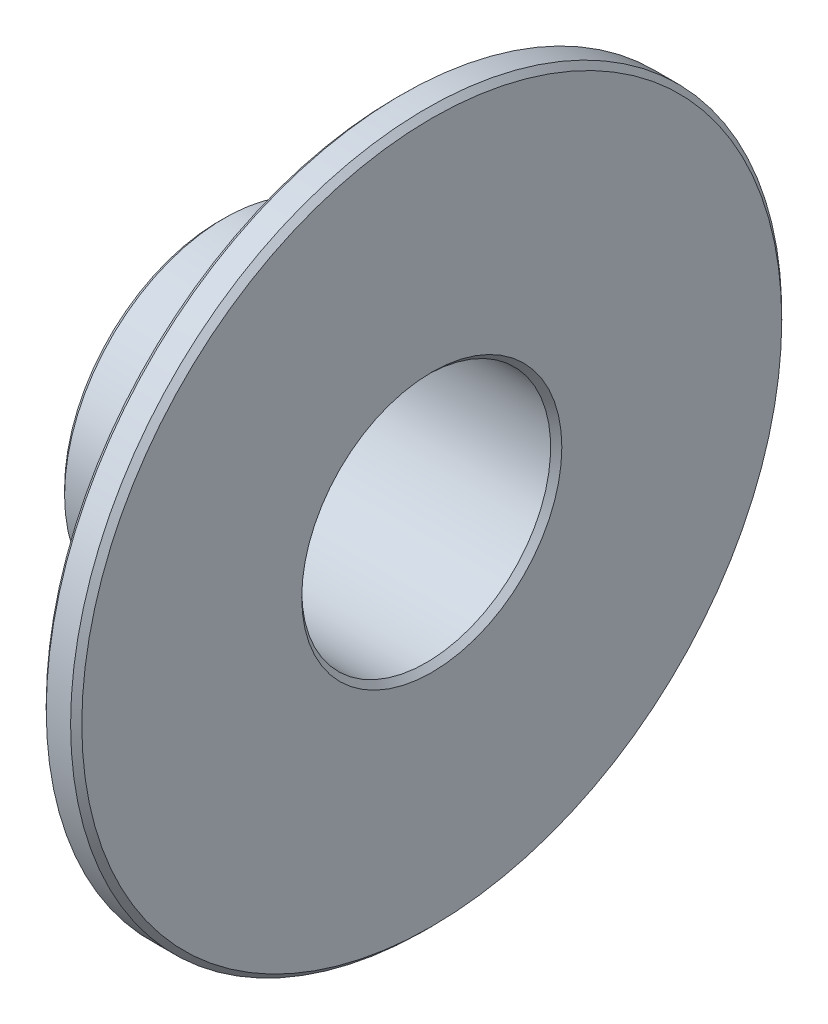
ISO-10303-21;
HEADER;
FILE_DESCRIPTION(('STEP AP214'),'2;1');
FILE_NAME('part.step','',(''),(''),'','','');
FILE_SCHEMA(('AUTOMOTIVE_DESIGN { 1 0 10303 214 1 1 1 1 }'));
ENDSEC;
DATA;
#1=APPLICATION_CONTEXT('core data for automotive mechanical design processes');
#2=APPLICATION_PROTOCOL_DEFINITION('international standard','automotive_design',2000,#1);
#3=PRODUCT_CONTEXT('',#1,'mechanical');
#4=PRODUCT('Part','Part','',(#3));
#5=PRODUCT_RELATED_PRODUCT_CATEGORY('part','',(#4));
#6=PRODUCT_DEFINITION_FORMATION('','',#4);
#7=PRODUCT_DEFINITION_CONTEXT('part definition',#1,'design');
#8=PRODUCT_DEFINITION('design','',#6,#7);
#9=PRODUCT_DEFINITION_SHAPE('','',#8);
#10=(LENGTH_UNIT() NAMED_UNIT(*) SI_UNIT(.MILLI.,.METRE.));
#11=(NAMED_UNIT(*) PLANE_ANGLE_UNIT() SI_UNIT($,.RADIAN.));
#12=(NAMED_UNIT(*) SI_UNIT($,.STERADIAN.) SOLID_ANGLE_UNIT());
#13=UNCERTAINTY_MEASURE_WITH_UNIT(LENGTH_MEASURE(1.E-05),#10,'distance_accuracy_value','');
#14=(GEOMETRIC_REPRESENTATION_CONTEXT(3) GLOBAL_UNCERTAINTY_ASSIGNED_CONTEXT((#13)) GLOBAL_UNIT_ASSIGNED_CONTEXT((#10,
#11,#12)) REPRESENTATION_CONTEXT('',''));
#15=CARTESIAN_POINT('',(0.,0.,0.));
#16=DIRECTION('',(0.,0.,1.));
#17=DIRECTION('',(1.,0.,0.));
#18=AXIS2_PLACEMENT_3D('',#15,#16,#17);
#19=CARTESIAN_POINT('',(0.,14.2875,0.));
#20=DIRECTION('',(1.,0.,0.));
#21=DIRECTION('',(0.,0.,-1.));
#22=AXIS2_PLACEMENT_3D('',#19,#20,#21);
#23=PLANE('',#22);
#24=CARTESIAN_POINT('',(0.,0.,0.));
#25=DIRECTION('',(-1.,0.,0.));
#26=DIRECTION('',(0.,0.,1.));
#27=AXIS2_PLACEMENT_3D('',#24,#25,#26);
#28=CIRCLE('',#27,14.2875);
#29=CARTESIAN_POINT('',(0.,0.,14.2875));
#30=VERTEX_POINT('',#29);
#31=EDGE_CURVE('E70',#30,#30,#28,.T.);
#32=ORIENTED_EDGE('',*,*,#31,.F.);
#33=EDGE_LOOP('',(#32));
#34=FACE_BOUND('',#33,.T.);
#35=CARTESIAN_POINT('',(0.,0.,0.));
#36=DIRECTION('',(-1.,0.,0.));
#37=DIRECTION('',(0.,0.,1.));
#38=AXIS2_PLACEMENT_3D('',#35,#36,#37);
#39=CIRCLE('',#38,31.25);
#40=CARTESIAN_POINT('',(0.,0.,31.25));
#41=VERTEX_POINT('',#40);
#42=EDGE_CURVE('E10',#41,#41,#39,.T.);
#43=ORIENTED_EDGE('',*,*,#42,.T.);
#44=EDGE_LOOP('',(#43));
#45=FACE_BOUND('',#44,.T.);
#46=ADVANCED_FACE('F33',(#34,#45),#23,.F.);
#47=CARTESIAN_POINT('',(0.5,0.,0.));
#48=DIRECTION('',(1.,0.,0.));
#49=DIRECTION('',(0.,0.,-1.));
#50=AXIS2_PLACEMENT_3D('',#47,#48,#49);
#51=CONICAL_SURFACE('',#50,31.75,0.785398163397449);
#52=ORIENTED_EDGE('',*,*,#42,.F.);
#53=EDGE_LOOP('',(#52));
#54=FACE_BOUND('',#53,.T.);
#55=CARTESIAN_POINT('',(0.5,0.,0.));
#56=DIRECTION('',(-1.,0.,0.));
#57=DIRECTION('',(0.,0.,1.));
#58=AXIS2_PLACEMENT_3D('',#55,#56,#57);
#59=CIRCLE('',#58,31.75);
#60=CARTESIAN_POINT('',(0.5,0.,31.75));
#61=VERTEX_POINT('',#60);
#62=EDGE_CURVE('E39',#61,#61,#59,.T.);
#63=ORIENTED_EDGE('',*,*,#62,.T.);
#64=EDGE_LOOP('',(#63));
#65=FACE_BOUND('',#64,.T.);
#66=ADVANCED_FACE('F77',(#54,#65),#51,.T.);
#67=CARTESIAN_POINT('',(0.,0.,0.));
#68=DIRECTION('',(-1.,0.,0.));
#69=DIRECTION('',(0.,0.,1.));
#70=AXIS2_PLACEMENT_3D('',#67,#68,#69);
#71=CYLINDRICAL_SURFACE('',#70,31.75);
#72=ORIENTED_EDGE('',*,*,#62,.F.);
#73=EDGE_LOOP('',(#72));
#74=FACE_BOUND('',#73,.T.);
#75=CARTESIAN_POINT('',(2.675,0.,0.));
#76=DIRECTION('',(-1.,0.,0.));
#77=DIRECTION('',(0.,0.,1.));
#78=AXIS2_PLACEMENT_3D('',#75,#76,#77);
#79=CIRCLE('',#78,31.75);
#80=CARTESIAN_POINT('',(2.675,0.,31.75));
#81=VERTEX_POINT('',#80);
#82=EDGE_CURVE('E43',#81,#81,#79,.T.);
#83=ORIENTED_EDGE('',*,*,#82,.T.);
#84=EDGE_LOOP('',(#83));
#85=FACE_BOUND('',#84,.T.);
#86=ADVANCED_FACE('F81',(#74,#85),#71,.T.);
#87=CARTESIAN_POINT('',(3.175,0.,0.));
#88=DIRECTION('',(-1.,0.,0.));
#89=DIRECTION('',(0.,0.,1.));
#90=AXIS2_PLACEMENT_3D('',#87,#88,#89);
#91=CONICAL_SURFACE('',#90,31.25,0.785398163397449);
#92=ORIENTED_EDGE('',*,*,#82,.F.);
#93=EDGE_LOOP('',(#92));
#94=FACE_BOUND('',#93,.T.);
#95=CARTESIAN_POINT('',(3.175,0.,0.));
#96=DIRECTION('',(-1.,0.,0.));
#97=DIRECTION('',(0.,0.,1.));
#98=AXIS2_PLACEMENT_3D('',#95,#96,#97);
#99=CIRCLE('',#98,31.25);
#100=CARTESIAN_POINT('',(3.175,0.,31.25));
#101=VERTEX_POINT('',#100);
#102=EDGE_CURVE('E47',#101,#101,#99,.T.);
#103=ORIENTED_EDGE('',*,*,#102,.T.);
#104=EDGE_LOOP('',(#103));
#105=FACE_BOUND('',#104,.T.);
#106=ADVANCED_FACE('F86',(#94,#105),#91,.T.);
#107=CARTESIAN_POINT('',(3.175,31.25,0.));
#108=DIRECTION('',(-1.,0.,0.));
#109=DIRECTION('',(0.,0.,1.));
#110=AXIS2_PLACEMENT_3D('',#107,#108,#109);
#111=PLANE('',#110);
#112=ORIENTED_EDGE('',*,*,#102,.F.);
#113=EDGE_LOOP('',(#112));
#114=FACE_BOUND('',#113,.T.);
#115=CARTESIAN_POINT('',(3.17500000000001,0.,0.));
#116=DIRECTION('',(-1.,0.,0.));
#117=DIRECTION('',(0.,0.,1.));
#118=AXIS2_PLACEMENT_3D('',#115,#116,#117);
#119=CIRCLE('',#118,11.6125);
#120=CARTESIAN_POINT('',(3.17500000000001,0.,11.6125));
#121=VERTEX_POINT('',#120);
#122=EDGE_CURVE('E52',#121,#121,#119,.T.);
#123=ORIENTED_EDGE('',*,*,#122,.T.);
#124=EDGE_LOOP('',(#123));
#125=FACE_BOUND('',#124,.T.);
#126=ADVANCED_FACE('F92',(#114,#125),#111,.F.);
#127=CARTESIAN_POINT('',(2.67500000000001,0.,0.));
#128=DIRECTION('',(1.,0.,0.));
#129=DIRECTION('',(0.,0.,-1.));
#130=AXIS2_PLACEMENT_3D('',#127,#128,#129);
#131=CONICAL_SURFACE('',#130,11.1125,0.785398163397449);
#132=ORIENTED_EDGE('',*,*,#122,.F.);
#133=EDGE_LOOP('',(#132));
#134=FACE_BOUND('',#133,.T.);
#135=CARTESIAN_POINT('',(2.67500000000001,0.,0.));
#136=DIRECTION('',(-1.,0.,0.));
#137=DIRECTION('',(0.,0.,1.));
#138=AXIS2_PLACEMENT_3D('',#135,#136,#137);
#139=CIRCLE('',#138,11.1125);
#140=CARTESIAN_POINT('',(2.67500000000001,0.,11.1125));
#141=VERTEX_POINT('',#140);
#142=EDGE_CURVE('E55',#141,#141,#139,.T.);
#143=ORIENTED_EDGE('',*,*,#142,.T.);
#144=EDGE_LOOP('',(#143));
#145=FACE_BOUND('',#144,.T.);
#146=ADVANCED_FACE('F96',(#134,#145),#131,.F.);
#147=CARTESIAN_POINT('',(0.,0.,0.));
#148=DIRECTION('',(-1.,0.,0.));
#149=DIRECTION('',(0.,0.,1.));
#150=AXIS2_PLACEMENT_3D('',#147,#148,#149);
#151=CYLINDRICAL_SURFACE('',#150,11.1125);
#152=ORIENTED_EDGE('',*,*,#142,.F.);
#153=EDGE_LOOP('',(#152));
#154=FACE_BOUND('',#153,.T.);
#155=CARTESIAN_POINT('',(-15.325,0.,0.));
#156=DIRECTION('',(-1.,0.,0.));
#157=DIRECTION('',(0.,0.,1.));
#158=AXIS2_PLACEMENT_3D('',#155,#156,#157);
#159=CIRCLE('',#158,11.1125);
#160=CARTESIAN_POINT('',(-15.325,0.,11.1125));
#161=VERTEX_POINT('',#160);
#162=EDGE_CURVE('E58',#161,#161,#159,.T.);
#163=ORIENTED_EDGE('',*,*,#162,.T.);
#164=EDGE_LOOP('',(#163));
#165=FACE_BOUND('',#164,.T.);
#166=ADVANCED_FACE('F100',(#154,#165),#151,.F.);
#167=CARTESIAN_POINT('',(-15.825,0.,0.));
#168=DIRECTION('',(-1.,0.,0.));
#169=DIRECTION('',(0.,0.,1.));
#170=AXIS2_PLACEMENT_3D('',#167,#168,#169);
#171=CONICAL_SURFACE('',#170,11.6125,0.785398163397448);
#172=ORIENTED_EDGE('',*,*,#162,.F.);
#173=EDGE_LOOP('',(#172));
#174=FACE_BOUND('',#173,.T.);
#175=CARTESIAN_POINT('',(-15.825,0.,0.));
#176=DIRECTION('',(-1.,0.,0.));
#177=DIRECTION('',(0.,0.,1.));
#178=AXIS2_PLACEMENT_3D('',#175,#176,#177);
#179=CIRCLE('',#178,11.6125);
#180=CARTESIAN_POINT('',(-15.825,0.,11.6125));
#181=VERTEX_POINT('',#180);
#182=EDGE_CURVE('E61',#181,#181,#179,.T.);
#183=ORIENTED_EDGE('',*,*,#182,.T.);
#184=EDGE_LOOP('',(#183));
#185=FACE_BOUND('',#184,.T.);
#186=ADVANCED_FACE('F104',(#174,#185),#171,.F.);
#187=CARTESIAN_POINT('',(-15.825,13.7875,0.));
#188=DIRECTION('',(1.,0.,0.));
#189=DIRECTION('',(0.,0.,-1.));
#190=AXIS2_PLACEMENT_3D('',#187,#188,#189);
#191=PLANE('',#190);
#192=ORIENTED_EDGE('',*,*,#182,.F.);
#193=EDGE_LOOP('',(#192));
#194=FACE_BOUND('',#193,.T.);
#195=CARTESIAN_POINT('',(-15.825,0.,0.));
#196=DIRECTION('',(-1.,0.,0.));
#197=DIRECTION('',(0.,0.,1.));
#198=AXIS2_PLACEMENT_3D('',#195,#196,#197);
#199=CIRCLE('',#198,13.7875);
#200=CARTESIAN_POINT('',(-15.825,0.,13.7875));
#201=VERTEX_POINT('',#200);
#202=EDGE_CURVE('E64',#201,#201,#199,.T.);
#203=ORIENTED_EDGE('',*,*,#202,.T.);
#204=EDGE_LOOP('',(#203));
#205=FACE_BOUND('',#204,.T.);
#206=ADVANCED_FACE('F108',(#194,#205),#191,.F.);
#207=CARTESIAN_POINT('',(-15.325,0.,0.));
#208=DIRECTION('',(1.,0.,0.));
#209=DIRECTION('',(0.,0.,-1.));
#210=AXIS2_PLACEMENT_3D('',#207,#208,#209);
#211=CONICAL_SURFACE('',#210,14.2875,0.785398163397448);
#212=ORIENTED_EDGE('',*,*,#202,.F.);
#213=EDGE_LOOP('',(#212));
#214=FACE_BOUND('',#213,.T.);
#215=CARTESIAN_POINT('',(-15.325,0.,0.));
#216=DIRECTION('',(-1.,0.,0.));
#217=DIRECTION('',(0.,0.,1.));
#218=AXIS2_PLACEMENT_3D('',#215,#216,#217);
#219=CIRCLE('',#218,14.2875);
#220=CARTESIAN_POINT('',(-15.325,0.,14.2875));
#221=VERTEX_POINT('',#220);
#222=EDGE_CURVE('E67',#221,#221,#219,.T.);
#223=ORIENTED_EDGE('',*,*,#222,.T.);
#224=EDGE_LOOP('',(#223));
#225=FACE_BOUND('',#224,.T.);
#226=ADVANCED_FACE('F112',(#214,#225),#211,.T.);
#227=CARTESIAN_POINT('',(0.,0.,0.));
#228=DIRECTION('',(-1.,0.,0.));
#229=DIRECTION('',(0.,0.,1.));
#230=AXIS2_PLACEMENT_3D('',#227,#228,#229);
#231=CYLINDRICAL_SURFACE('',#230,14.2875);
#232=ORIENTED_EDGE('',*,*,#222,.F.);
#233=EDGE_LOOP('',(#232));
#234=FACE_BOUND('',#233,.T.);
#235=ORIENTED_EDGE('',*,*,#31,.T.);
#236=EDGE_LOOP('',(#235));
#237=FACE_BOUND('',#236,.T.);
#238=ADVANCED_FACE('F74',(#234,#237),#231,.T.);
#239=CLOSED_SHELL('',(#46,#66,#86,#106,#126,#146,#166,#186,#206,#226,#238));
#240=MANIFOLD_SOLID_BREP('B2',#239);
#241=ADVANCED_BREP_SHAPE_REPRESENTATION('',(#18,#240),#14);
#242=SHAPE_DEFINITION_REPRESENTATION(#9,#241);
ENDSEC;
END-ISO-10303-21;
